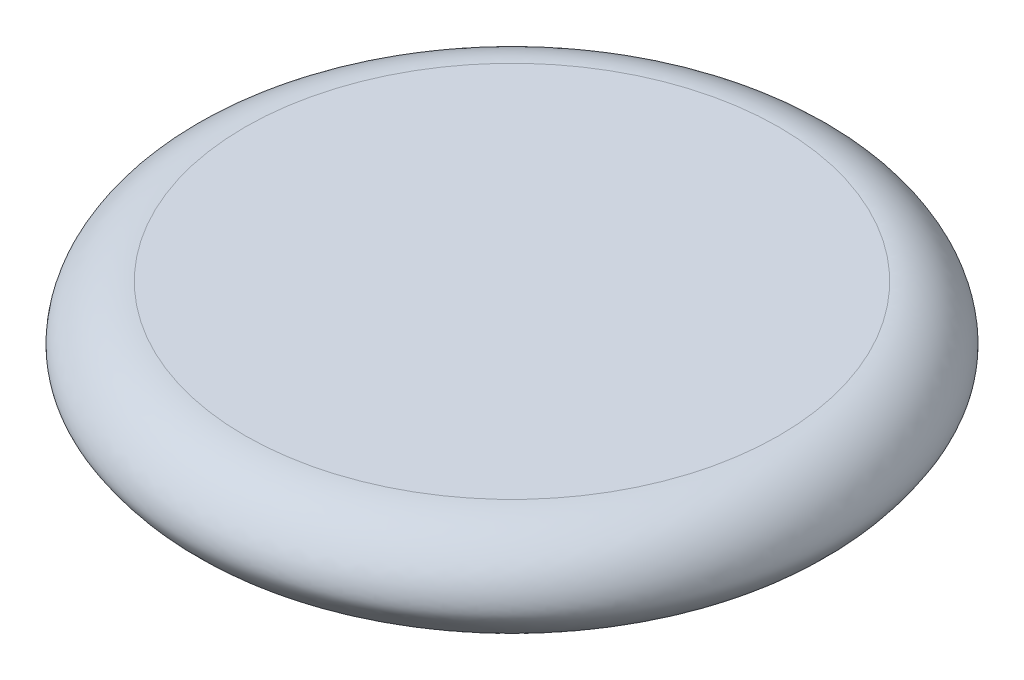
ISO-10303-21;
HEADER;
FILE_DESCRIPTION(('STEP AP214'),'2;1');
FILE_NAME('part.step','',(''),(''),'','','');
FILE_SCHEMA(('AUTOMOTIVE_DESIGN { 1 0 10303 214 1 1 1 1 }'));
ENDSEC;
DATA;
#1=APPLICATION_CONTEXT('core data for automotive mechanical design processes');
#2=APPLICATION_PROTOCOL_DEFINITION('international standard','automotive_design',2000,#1);
#3=PRODUCT_CONTEXT('',#1,'mechanical');
#4=PRODUCT('Part','Part','',(#3));
#5=PRODUCT_RELATED_PRODUCT_CATEGORY('part','',(#4));
#6=PRODUCT_DEFINITION_FORMATION('','',#4);
#7=PRODUCT_DEFINITION_CONTEXT('part definition',#1,'design');
#8=PRODUCT_DEFINITION('design','',#6,#7);
#9=PRODUCT_DEFINITION_SHAPE('','',#8);
#10=(LENGTH_UNIT() NAMED_UNIT(*) SI_UNIT(.MILLI.,.METRE.));
#11=(NAMED_UNIT(*) PLANE_ANGLE_UNIT() SI_UNIT($,.RADIAN.));
#12=(NAMED_UNIT(*) SI_UNIT($,.STERADIAN.) SOLID_ANGLE_UNIT());
#13=UNCERTAINTY_MEASURE_WITH_UNIT(LENGTH_MEASURE(1.E-05),#10,'distance_accuracy_value','');
#14=(GEOMETRIC_REPRESENTATION_CONTEXT(3) GLOBAL_UNCERTAINTY_ASSIGNED_CONTEXT((#13)) GLOBAL_UNIT_ASSIGNED_CONTEXT((#10,
#11,#12)) REPRESENTATION_CONTEXT('',''));
#15=CARTESIAN_POINT('',(0.,0.,0.));
#16=DIRECTION('',(0.,0.,1.));
#17=DIRECTION('',(1.,0.,0.));
#18=AXIS2_PLACEMENT_3D('',#15,#16,#17);
#19=CARTESIAN_POINT('',(-9.46909653103792E-05,19.9105866035952,0.));
#20=DIRECTION('',(0.,1.,0.));
#21=DIRECTION('',(0.,0.,1.));
#22=AXIS2_PLACEMENT_3D('',#19,#20,#21);
#23=PLANE('',#22);
#24=CARTESIAN_POINT('',(-9.46909653103792E-05,19.9105866035952,0.));
#25=DIRECTION('',(0.,-1.,0.));
#26=DIRECTION('',(0.,0.,-1.));
#27=AXIS2_PLACEMENT_3D('',#24,#25,#26);
#28=CIRCLE('',#27,104.095324845724);
#29=CARTESIAN_POINT('',(-9.46909653103792E-05,19.9105866035952,-104.095324845724));
#30=VERTEX_POINT('',#29);
#31=EDGE_CURVE('E10',#30,#30,#28,.T.);
#32=ORIENTED_EDGE('',*,*,#31,.F.);
#33=EDGE_LOOP('',(#32));
#34=FACE_BOUND('',#33,.T.);
#35=ADVANCED_FACE('F35',(#34),#23,.T.);
#36=CARTESIAN_POINT('',(-9.46909653103792E-05,-14.0601166363523,-106.546115125707));
#37=CARTESIAN_POINT('',(-9.46909653103792E-05,-16.0244477012113,-108.865781173004));
#38=CARTESIAN_POINT('',(-9.46909653103792E-05,-17.5260170286325,-114.228212727045));
#39=CARTESIAN_POINT('',(-9.46909653103792E-05,-13.6007023902807,-121.39300028723));
#40=CARTESIAN_POINT('',(-9.46909653103792E-05,-8.63159718758088,-125.346210292287));
#41=CARTESIAN_POINT('',(-9.46909653103792E-05,-3.34981185203271,-128.62550048325));
#42=CARTESIAN_POINT('',(-9.46909653103792E-05,2.36650992901477,-128.321838744112));
#43=CARTESIAN_POINT('',(-9.46909653103792E-05,13.8900932084606,-123.422791357621));
#44=CARTESIAN_POINT('',(-9.46909653103792E-05,20.0409938321692,-112.641824996961));
#45=CARTESIAN_POINT('',(-9.46909653103792E-05,19.9105866035952,-104.095324845724));
#46=B_SPLINE_CURVE_WITH_KNOTS('',3,(#36,#37,#38,#39,#40,#41,#42,#43,#44,#45),.UNSPECIFIED.,.F.,
.F.,(4,1,1,1,1,1,1,4),(0.,0.141681258807479,0.22222914749353,0.362081330875334,
0.432703547780047,0.500097168553096,0.615062154999471,1.),.UNSPECIFIED.);
#47=CARTESIAN_POINT('',(-9.46909653103792E-05,-3.15879563358115,0.));
#48=DIRECTION('',(0.,-1.,0.));
#49=AXIS1_PLACEMENT('',#47,#48);
#50=SURFACE_OF_REVOLUTION('',#46,#49);
#51=ORIENTED_EDGE('',*,*,#31,.T.);
#52=EDGE_LOOP('',(#51));
#53=FACE_BOUND('',#52,.T.);
#54=CARTESIAN_POINT('',(-9.46909653103792E-05,-14.0601166363523,0.));
#55=DIRECTION('',(0.,-1.,0.));
#56=DIRECTION('',(0.,0.,-1.));
#57=AXIS2_PLACEMENT_3D('',#54,#55,#56);
#58=CIRCLE('',#57,106.546115125707);
#59=CARTESIAN_POINT('',(-9.46909653103792E-05,-14.0601166363523,-106.546115125707));
#60=VERTEX_POINT('',#59);
#61=EDGE_CURVE('E41',#60,#60,#58,.T.);
#62=ORIENTED_EDGE('',*,*,#61,.F.);
#63=EDGE_LOOP('',(#62));
#64=FACE_BOUND('',#63,.T.);
#65=ADVANCED_FACE('F61',(#53,#64),#50,.F.);
#66=CARTESIAN_POINT('',(-9.46909653103792E-05,-11.6237612670055,-101.606680635543));
#67=CARTESIAN_POINT('',(-9.46909653103792E-05,-11.6046815893995,-103.484460606804));
#68=CARTESIAN_POINT('',(-9.46909653103792E-05,-12.5932713980807,-105.411219784441));
#69=CARTESIAN_POINT('',(-9.46909653103792E-05,-14.0601166363523,-106.546115125707));
#70=B_SPLINE_CURVE_WITH_KNOTS('',3,(#66,#67,#68,#69),.UNSPECIFIED.,.F.,.F.,(4,4),(0.,1.),.UNSPECIFIED.);
#71=CARTESIAN_POINT('',(-9.46909653103792E-05,-3.15879563358115,0.));
#72=DIRECTION('',(0.,-1.,0.));
#73=AXIS1_PLACEMENT('',#71,#72);
#74=SURFACE_OF_REVOLUTION('',#70,#73);
#75=ORIENTED_EDGE('',*,*,#61,.T.);
#76=EDGE_LOOP('',(#75));
#77=FACE_BOUND('',#76,.T.);
#78=CARTESIAN_POINT('',(-9.46909653103792E-05,-11.6237612670055,0.));
#79=DIRECTION('',(0.,-1.,0.));
#80=DIRECTION('',(0.,0.,-1.));
#81=AXIS2_PLACEMENT_3D('',#78,#79,#80);
#82=CIRCLE('',#81,101.606680635543);
#83=CARTESIAN_POINT('',(-9.46909653103792E-05,-11.6237612670055,-101.606680635543));
#84=VERTEX_POINT('',#83);
#85=EDGE_CURVE('E45',#84,#84,#82,.T.);
#86=ORIENTED_EDGE('',*,*,#85,.F.);
#87=EDGE_LOOP('',(#86));
#88=FACE_BOUND('',#87,.T.);
#89=ADVANCED_FACE('F64',(#77,#88),#74,.F.);
#90=CARTESIAN_POINT('',(-9.46909653103792E-05,-11.6237612670055,-101.606680635543));
#91=DIRECTION('',(0.,-1.,0.));
#92=DIRECTION('',(0.,0.,-1.));
#93=AXIS2_PLACEMENT_3D('',#90,#91,#92);
#94=PLANE('',#93);
#95=ORIENTED_EDGE('',*,*,#85,.T.);
#96=EDGE_LOOP('',(#95));
#97=FACE_BOUND('',#96,.T.);
#98=ADVANCED_FACE('F67',(#97),#94,.T.);
#99=CLOSED_SHELL('',(#35,#65,#89,#98));
#100=MANIFOLD_SOLID_BREP('B2',#99);
#101=ADVANCED_BREP_SHAPE_REPRESENTATION('',(#18,#100),#14);
#102=SHAPE_DEFINITION_REPRESENTATION(#9,#101);
ENDSEC;
END-ISO-10303-21;
